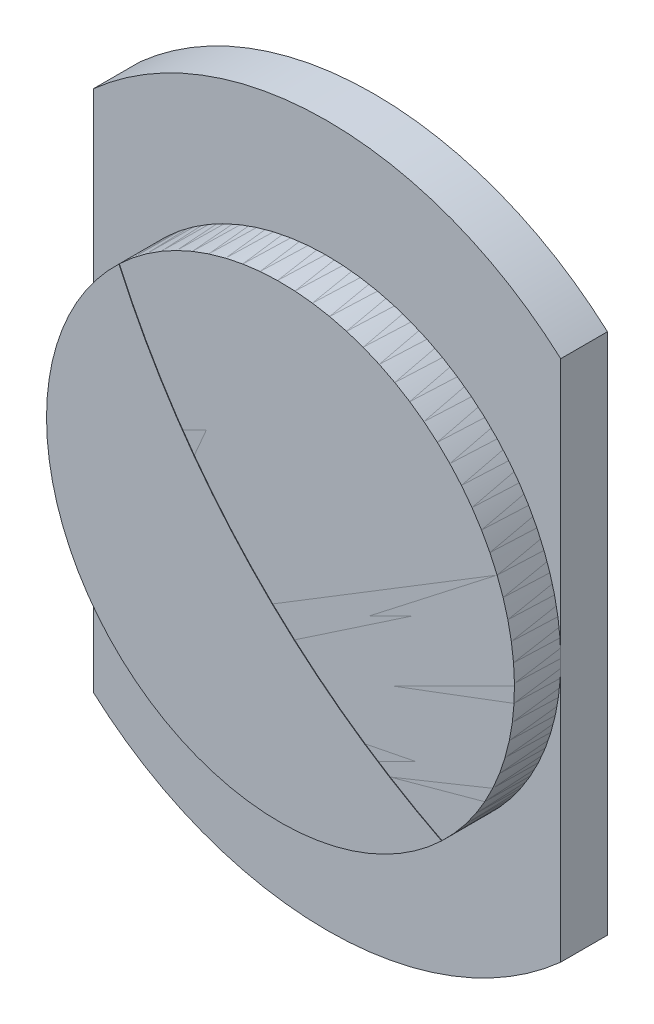
ISO-10303-21;
HEADER;
FILE_DESCRIPTION(('STEP AP214'),'2;1');
FILE_NAME('part.step','',(''),(''),'','','');
FILE_SCHEMA(('AUTOMOTIVE_DESIGN { 1 0 10303 214 1 1 1 1 }'));
ENDSEC;
DATA;
#1=APPLICATION_CONTEXT('core data for automotive mechanical design processes');
#2=APPLICATION_PROTOCOL_DEFINITION('international standard','automotive_design',2000,#1);
#3=PRODUCT_CONTEXT('',#1,'mechanical');
#4=PRODUCT('Part','Part','',(#3));
#5=PRODUCT_RELATED_PRODUCT_CATEGORY('part','',(#4));
#6=PRODUCT_DEFINITION_FORMATION('','',#4);
#7=PRODUCT_DEFINITION_CONTEXT('part definition',#1,'design');
#8=PRODUCT_DEFINITION('design','',#6,#7);
#9=PRODUCT_DEFINITION_SHAPE('','',#8);
#10=(LENGTH_UNIT() NAMED_UNIT(*) SI_UNIT(.MILLI.,.METRE.));
#11=(NAMED_UNIT(*) PLANE_ANGLE_UNIT() SI_UNIT($,.RADIAN.));
#12=(NAMED_UNIT(*) SI_UNIT($,.STERADIAN.) SOLID_ANGLE_UNIT());
#13=UNCERTAINTY_MEASURE_WITH_UNIT(LENGTH_MEASURE(1.E-05),#10,'distance_accuracy_value','');
#14=(GEOMETRIC_REPRESENTATION_CONTEXT(3) GLOBAL_UNCERTAINTY_ASSIGNED_CONTEXT((#13)) GLOBAL_UNIT_ASSIGNED_CONTEXT((#10,
#11,#12)) REPRESENTATION_CONTEXT('',''));
#15=CARTESIAN_POINT('',(0.,0.,0.));
#16=DIRECTION('',(0.,0.,1.));
#17=DIRECTION('',(1.,0.,0.));
#18=AXIS2_PLACEMENT_3D('',#15,#16,#17);
#19=CARTESIAN_POINT('',(10.2337230542793,9.76068196635418,-12.070248418297));
#20=DIRECTION('',(0.,0.,1.));
#21=DIRECTION('',(1.,0.,0.));
#22=AXIS2_PLACEMENT_3D('',#19,#20,#21);
#23=CYLINDRICAL_SURFACE('',#22,15.);
#24=CARTESIAN_POINT('',(10.2337230542793,9.76068196635418,0.));
#25=DIRECTION('',(0.,0.,1.));
#26=DIRECTION('',(1.,0.,0.));
#27=AXIS2_PLACEMENT_3D('',#24,#25,#26);
#28=CIRCLE('',#27,15.);
#29=CARTESIAN_POINT('',(3.45092220370713,-3.61816748423302,0.));
#30=VERTEX_POINT('',#29);
#31=CARTESIAN_POINT('',(-3.45092220370715,3.618167484233,0.));
#32=VERTEX_POINT('',#31);
#33=EDGE_CURVE('E66',#30,#32,#28,.F.);
#34=ORIENTED_EDGE('',*,*,#33,.F.);
#35=DIRECTION('',(0.,0.,1.));
#36=VECTOR('',#35,1.);
#37=CARTESIAN_POINT('',(3.45092220370713,-3.61816748423302,-12.070248418297));
#38=LINE('',#37,#36);
#39=CARTESIAN_POINT('',(3.45092220370713,-3.61816748423302,1.99));
#40=VERTEX_POINT('',#39);
#41=EDGE_CURVE('E86',#30,#40,#38,.T.);
#42=ORIENTED_EDGE('',*,*,#41,.T.);
#43=CARTESIAN_POINT('',(10.2337230542793,9.76068196635418,1.99));
#44=DIRECTION('',(0.,0.,1.));
#45=DIRECTION('',(1.,0.,0.));
#46=AXIS2_PLACEMENT_3D('',#43,#44,#45);
#47=CIRCLE('',#46,15.);
#48=CARTESIAN_POINT('',(-3.45092220370715,3.618167484233,1.99));
#49=VERTEX_POINT('',#48);
#50=EDGE_CURVE('E88',#49,#40,#47,.T.);
#51=ORIENTED_EDGE('',*,*,#50,.F.);
#52=DIRECTION('',(0.,0.,1.));
#53=VECTOR('',#52,1.);
#54=CARTESIAN_POINT('',(-3.45092220370715,3.618167484233,-12.070248418297));
#55=LINE('',#54,#53);
#56=EDGE_CURVE('E92',#32,#49,#55,.T.);
#57=ORIENTED_EDGE('',*,*,#56,.F.);
#58=EDGE_LOOP('',(#34,#42,#51,#57));
#59=FACE_BOUND('',#58,.T.);
#60=ADVANCED_FACE('F56',(#59),#23,.T.);
#61=CARTESIAN_POINT('',(0.,0.,-12.070248418297));
#62=DIRECTION('',(0.,0.,1.));
#63=DIRECTION('',(1.,0.,0.));
#64=AXIS2_PLACEMENT_3D('',#61,#62,#63);
#65=CYLINDRICAL_SURFACE('',#64,5.);
#66=CARTESIAN_POINT('',(0.,0.,0.));
#67=DIRECTION('',(0.,0.,1.));
#68=DIRECTION('',(1.,0.,0.));
#69=AXIS2_PLACEMENT_3D('',#66,#67,#68);
#70=CIRCLE('',#69,5.);
#71=EDGE_CURVE('E12',#32,#30,#70,.F.);
#72=ORIENTED_EDGE('',*,*,#71,.F.);
#73=ORIENTED_EDGE('',*,*,#56,.T.);
#74=CARTESIAN_POINT('',(0.,0.,1.99));
#75=DIRECTION('',(0.,0.,1.));
#76=DIRECTION('',(1.,0.,0.));
#77=AXIS2_PLACEMENT_3D('',#74,#75,#76);
#78=CIRCLE('',#77,5.);
#79=EDGE_CURVE('E94',#40,#49,#78,.T.);
#80=ORIENTED_EDGE('',*,*,#79,.F.);
#81=ORIENTED_EDGE('',*,*,#41,.F.);
#82=EDGE_LOOP('',(#72,#73,#80,#81));
#83=FACE_BOUND('',#82,.T.);
#84=ADVANCED_FACE('F99',(#83),#65,.T.);
#85=CARTESIAN_POINT('',(5.11686152713966,4.88034098317709,1.99));
#86=DIRECTION('',(0.,0.,1.));
#87=DIRECTION('',(1.,0.,0.));
#88=AXIS2_PLACEMENT_3D('',#85,#86,#87);
#89=PLANE('',#88);
#90=ORIENTED_EDGE('',*,*,#50,.T.);
#91=ORIENTED_EDGE('',*,*,#79,.T.);
#92=EDGE_LOOP('',(#90,#91));
#93=FACE_BOUND('',#92,.T.);
#94=ADVANCED_FACE('F97',(#93),#89,.T.);
#95=CARTESIAN_POINT('',(0.,0.,0.));
#96=DIRECTION('',(0.,0.,1.));
#97=DIRECTION('',(1.,0.,0.));
#98=AXIS2_PLACEMENT_3D('',#95,#96,#97);
#99=PLANE('',#98);
#100=ORIENTED_EDGE('',*,*,#33,.T.);
#101=ORIENTED_EDGE('',*,*,#71,.T.);
#102=EDGE_LOOP('',(#100,#101));
#103=FACE_BOUND('',#102,.T.);
#104=ADVANCED_FACE('F113',(#103),#99,.F.);
#105=CLOSED_SHELL('',(#60,#84,#94,#104));
#106=MANIFOLD_SOLID_BREP('B2',#105);
#107=CARTESIAN_POINT('',(0.,0.,1.));
#108=DIRECTION('',(0.,0.,1.));
#109=DIRECTION('',(1.,0.,0.));
#110=AXIS2_PLACEMENT_3D('',#107,#108,#109);
#111=PLANE('',#110);
#112=CARTESIAN_POINT('',(0.,0.,1.));
#113=DIRECTION('',(0.,0.,1.));
#114=DIRECTION('',(1.,0.,0.));
#115=AXIS2_PLACEMENT_3D('',#112,#113,#114);
#116=CIRCLE('',#115,7.5);
#117=CARTESIAN_POINT('',(5.,5.59016994374947,1.));
#118=VERTEX_POINT('',#117);
#119=CARTESIAN_POINT('',(-5.,5.59016994374947,1.));
#120=VERTEX_POINT('',#119);
#121=EDGE_CURVE('E275',#118,#120,#116,.T.);
#122=ORIENTED_EDGE('',*,*,#121,.T.);
#123=DIRECTION('',(0.,-1.,0.));
#124=VECTOR('',#123,1.);
#125=CARTESIAN_POINT('',(-5.,0.,1.));
#126=LINE('',#125,#124);
#127=CARTESIAN_POINT('',(-5.,0.,1.));
#128=VERTEX_POINT('',#127);
#129=EDGE_CURVE('E244',#120,#128,#126,.T.);
#130=ORIENTED_EDGE('',*,*,#129,.T.);
#131=CARTESIAN_POINT('',(0.,0.,1.));
#132=DIRECTION('',(0.,0.,1.));
#133=DIRECTION('',(1.,0.,0.));
#134=AXIS2_PLACEMENT_3D('',#131,#132,#133);
#135=CIRCLE('',#134,5.);
#136=CARTESIAN_POINT('',(5.,0.,1.));
#137=VERTEX_POINT('',#136);
#138=EDGE_CURVE('E151',#137,#128,#135,.T.);
#139=ORIENTED_EDGE('',*,*,#138,.F.);
#140=DIRECTION('',(0.,-1.,0.));
#141=VECTOR('',#140,1.);
#142=CARTESIAN_POINT('',(5.,0.,1.));
#143=LINE('',#142,#141);
#144=EDGE_CURVE('E257',#118,#137,#143,.T.);
#145=ORIENTED_EDGE('',*,*,#144,.F.);
#146=EDGE_LOOP('',(#122,#130,#139,#145));
#147=FACE_BOUND('',#146,.T.);
#148=ADVANCED_FACE('F141',(#147),#111,.T.);
#149=EDGE_CURVE('E272',#128,#137,#135,.T.);
#150=ORIENTED_EDGE('',*,*,#149,.F.);
#151=CARTESIAN_POINT('',(-5.,-5.59016994374947,1.));
#152=VERTEX_POINT('',#151);
#153=EDGE_CURVE('E243',#128,#152,#126,.T.);
#154=ORIENTED_EDGE('',*,*,#153,.T.);
#155=CARTESIAN_POINT('',(5.,-5.59016994374947,1.));
#156=VERTEX_POINT('',#155);
#157=EDGE_CURVE('E273',#152,#156,#116,.T.);
#158=ORIENTED_EDGE('',*,*,#157,.T.);
#159=EDGE_CURVE('E236',#137,#156,#143,.T.);
#160=ORIENTED_EDGE('',*,*,#159,.F.);
#161=EDGE_LOOP('',(#150,#154,#158,#160));
#162=FACE_BOUND('',#161,.T.);
#163=ADVANCED_FACE('F303',(#162),#111,.T.);
#164=CARTESIAN_POINT('',(0.,0.,0.));
#165=DIRECTION('',(0.,0.,1.));
#166=DIRECTION('',(1.,0.,0.));
#167=AXIS2_PLACEMENT_3D('',#164,#165,#166);
#168=PLANE('',#167);
#169=CARTESIAN_POINT('',(0.,0.,0.));
#170=DIRECTION('',(0.,0.,1.));
#171=DIRECTION('',(1.,0.,0.));
#172=AXIS2_PLACEMENT_3D('',#169,#170,#171);
#173=CIRCLE('',#172,7.5);
#174=CARTESIAN_POINT('',(-5.,-5.59016994374947,0.));
#175=VERTEX_POINT('',#174);
#176=CARTESIAN_POINT('',(5.,-5.59016994374947,0.));
#177=VERTEX_POINT('',#176);
#178=EDGE_CURVE('E270',#175,#177,#173,.T.);
#179=ORIENTED_EDGE('',*,*,#178,.F.);
#180=DIRECTION('',(0.,1.,0.));
#181=VECTOR('',#180,1.);
#182=CARTESIAN_POINT('',(-5.,0.,0.));
#183=LINE('',#182,#181);
#184=CARTESIAN_POINT('',(-5.,5.59016994374947,0.));
#185=VERTEX_POINT('',#184);
#186=EDGE_CURVE('E239',#175,#185,#183,.T.);
#187=ORIENTED_EDGE('',*,*,#186,.T.);
#188=CARTESIAN_POINT('',(5.,5.59016994374947,0.));
#189=VERTEX_POINT('',#188);
#190=EDGE_CURVE('E277',#189,#185,#173,.T.);
#191=ORIENTED_EDGE('',*,*,#190,.F.);
#192=DIRECTION('',(0.,1.,0.));
#193=VECTOR('',#192,1.);
#194=CARTESIAN_POINT('',(5.,0.,0.));
#195=LINE('',#194,#193);
#196=EDGE_CURVE('E242',#177,#189,#195,.T.);
#197=ORIENTED_EDGE('',*,*,#196,.F.);
#198=EDGE_LOOP('',(#179,#187,#191,#197));
#199=FACE_BOUND('',#198,.T.);
#200=ADVANCED_FACE('F292',(#199),#168,.F.);
#201=CARTESIAN_POINT('',(0.,0.,1.));
#202=DIRECTION('',(0.,0.,-1.));
#203=DIRECTION('',(-1.,0.,0.));
#204=AXIS2_PLACEMENT_3D('',#201,#202,#203);
#205=CYLINDRICAL_SURFACE('',#204,7.5);
#206=DIRECTION('',(0.,0.,1.));
#207=VECTOR('',#206,1.);
#208=CARTESIAN_POINT('',(-5.,-5.59016994374947,-0.000999999999999916));
#209=LINE('',#208,#207);
#210=EDGE_CURVE('E249',#175,#152,#209,.T.);
#211=ORIENTED_EDGE('',*,*,#210,.F.);
#212=ORIENTED_EDGE('',*,*,#178,.T.);
#213=DIRECTION('',(0.,0.,1.));
#214=VECTOR('',#213,1.);
#215=CARTESIAN_POINT('',(5.,-5.59016994374947,-0.000999999999999916));
#216=LINE('',#215,#214);
#217=EDGE_CURVE('E167',#177,#156,#216,.T.);
#218=ORIENTED_EDGE('',*,*,#217,.T.);
#219=ORIENTED_EDGE('',*,*,#157,.F.);
#220=EDGE_LOOP('',(#211,#212,#218,#219));
#221=FACE_BOUND('',#220,.T.);
#222=ADVANCED_FACE('F143',(#221),#205,.T.);
#223=ORIENTED_EDGE('',*,*,#190,.T.);
#224=DIRECTION('',(0.,0.,1.));
#225=VECTOR('',#224,1.);
#226=CARTESIAN_POINT('',(-5.,5.59016994374947,-0.000999999999999916));
#227=LINE('',#226,#225);
#228=EDGE_CURVE('E248',#185,#120,#227,.T.);
#229=ORIENTED_EDGE('',*,*,#228,.T.);
#230=ORIENTED_EDGE('',*,*,#121,.F.);
#231=DIRECTION('',(0.,0.,1.));
#232=VECTOR('',#231,1.);
#233=CARTESIAN_POINT('',(5.,5.59016994374947,-0.000999999999999916));
#234=LINE('',#233,#232);
#235=EDGE_CURVE('E256',#189,#118,#234,.T.);
#236=ORIENTED_EDGE('',*,*,#235,.F.);
#237=EDGE_LOOP('',(#223,#229,#230,#236));
#238=FACE_BOUND('',#237,.T.);
#239=ADVANCED_FACE('F298',(#238),#205,.T.);
#240=CARTESIAN_POINT('',(0.,0.,2.));
#241=DIRECTION('',(0.,0.,-1.));
#242=DIRECTION('',(-1.,0.,0.));
#243=AXIS2_PLACEMENT_3D('',#240,#241,#242);
#244=CYLINDRICAL_SURFACE('',#243,5.);
#245=CARTESIAN_POINT('',(0.,0.,1.99));
#246=DIRECTION('',(0.,0.,1.));
#247=DIRECTION('',(1.,0.,0.));
#248=AXIS2_PLACEMENT_3D('',#245,#246,#247);
#249=CIRCLE('',#248,5.);
#250=CARTESIAN_POINT('',(3.45092220370714,-3.61816748423301,1.99));
#251=VERTEX_POINT('',#250);
#252=CARTESIAN_POINT('',(-3.45092220370715,3.61816748423301,1.99));
#253=VERTEX_POINT('',#252);
#254=EDGE_CURVE('E60',#251,#253,#249,.T.);
#255=ORIENTED_EDGE('',*,*,#254,.F.);
#256=DIRECTION('',(0.,0.,1.));
#257=VECTOR('',#256,1.);
#258=CARTESIAN_POINT('',(3.45092220370714,-3.61816748423301,1.995));
#259=LINE('',#258,#257);
#260=CARTESIAN_POINT('',(3.45092220370714,-3.61816748423301,2.));
#261=VERTEX_POINT('',#260);
#262=EDGE_CURVE('E225',#251,#261,#259,.T.);
#263=ORIENTED_EDGE('',*,*,#262,.T.);
#264=CARTESIAN_POINT('',(0.,0.,2.));
#265=DIRECTION('',(0.,0.,1.));
#266=DIRECTION('',(1.,0.,0.));
#267=AXIS2_PLACEMENT_3D('',#264,#265,#266);
#268=CIRCLE('',#267,5.);
#269=CARTESIAN_POINT('',(-3.45092220370715,3.61816748423301,2.));
#270=VERTEX_POINT('',#269);
#271=EDGE_CURVE('E229',#270,#261,#268,.T.);
#272=ORIENTED_EDGE('',*,*,#271,.F.);
#273=DIRECTION('',(0.,0.,1.));
#274=VECTOR('',#273,1.);
#275=CARTESIAN_POINT('',(-3.45092220370715,3.61816748423301,1.995));
#276=LINE('',#275,#274);
#277=EDGE_CURVE('E217',#270,#253,#276,.F.);
#278=ORIENTED_EDGE('',*,*,#277,.T.);
#279=EDGE_LOOP('',(#255,#263,#272,#278));
#280=FACE_BOUND('',#279,.T.);
#281=ORIENTED_EDGE('',*,*,#138,.T.);
#282=ORIENTED_EDGE('',*,*,#149,.T.);
#283=EDGE_LOOP('',(#281,#282));
#284=FACE_BOUND('',#283,.T.);
#285=ADVANCED_FACE('F227',(#280,#284),#244,.T.);
#286=CARTESIAN_POINT('',(0.,0.,2.));
#287=DIRECTION('',(0.,0.,1.));
#288=DIRECTION('',(1.,0.,0.));
#289=AXIS2_PLACEMENT_3D('',#286,#287,#288);
#290=PLANE('',#289);
#291=CARTESIAN_POINT('',(10.2337230542793,9.76068196635418,2.));
#292=DIRECTION('',(0.,0.,1.));
#293=DIRECTION('',(1.,0.,0.));
#294=AXIS2_PLACEMENT_3D('',#291,#292,#293);
#295=CIRCLE('',#294,15.);
#296=EDGE_CURVE('E222',#270,#261,#295,.T.);
#297=ORIENTED_EDGE('',*,*,#296,.F.);
#298=ORIENTED_EDGE('',*,*,#271,.T.);
#299=EDGE_LOOP('',(#297,#298));
#300=FACE_BOUND('',#299,.T.);
#301=ADVANCED_FACE('F307',(#300),#290,.T.);
#302=CARTESIAN_POINT('',(5.,0.,-0.000999999999999916));
#303=DIRECTION('',(-1.,0.,0.));
#304=DIRECTION('',(0.,0.,1.));
#305=AXIS2_PLACEMENT_3D('',#302,#303,#304);
#306=PLANE('',#305);
#307=ORIENTED_EDGE('',*,*,#196,.T.);
#308=ORIENTED_EDGE('',*,*,#235,.T.);
#309=ORIENTED_EDGE('',*,*,#144,.T.);
#310=ORIENTED_EDGE('',*,*,#159,.T.);
#311=ORIENTED_EDGE('',*,*,#217,.F.);
#312=EDGE_LOOP('',(#307,#308,#309,#310,#311));
#313=FACE_BOUND('',#312,.T.);
#314=ADVANCED_FACE('F291',(#313),#306,.F.);
#315=CARTESIAN_POINT('',(-5.,0.,-0.000999999999999916));
#316=DIRECTION('',(-1.,0.,0.));
#317=DIRECTION('',(0.,0.,1.));
#318=AXIS2_PLACEMENT_3D('',#315,#316,#317);
#319=PLANE('',#318);
#320=ORIENTED_EDGE('',*,*,#210,.T.);
#321=ORIENTED_EDGE('',*,*,#153,.F.);
#322=ORIENTED_EDGE('',*,*,#129,.F.);
#323=ORIENTED_EDGE('',*,*,#228,.F.);
#324=ORIENTED_EDGE('',*,*,#186,.F.);
#325=EDGE_LOOP('',(#320,#321,#322,#323,#324));
#326=FACE_BOUND('',#325,.T.);
#327=ADVANCED_FACE('F320',(#326),#319,.T.);
#328=CARTESIAN_POINT('',(10.2337230542793,9.76068196635418,1.99));
#329=DIRECTION('',(0.,0.,1.));
#330=DIRECTION('',(1.,0.,0.));
#331=AXIS2_PLACEMENT_3D('',#328,#329,#330);
#332=PLANE('',#331);
#333=ORIENTED_EDGE('',*,*,#254,.T.);
#334=CARTESIAN_POINT('',(10.2337230542793,9.76068196635418,1.99));
#335=DIRECTION('',(0.,0.,1.));
#336=DIRECTION('',(1.,0.,0.));
#337=AXIS2_PLACEMENT_3D('',#334,#335,#336);
#338=CIRCLE('',#337,15.);
#339=EDGE_CURVE('E159',#253,#251,#338,.T.);
#340=ORIENTED_EDGE('',*,*,#339,.T.);
#341=EDGE_LOOP('',(#333,#340));
#342=FACE_BOUND('',#341,.T.);
#343=ADVANCED_FACE('F211',(#342),#332,.T.);
#344=CARTESIAN_POINT('',(10.2337230542793,9.76068196635418,1.99));
#345=DIRECTION('',(0.,0.,1.));
#346=DIRECTION('',(1.,0.,0.));
#347=AXIS2_PLACEMENT_3D('',#344,#345,#346);
#348=CYLINDRICAL_SURFACE('',#347,15.);
#349=ORIENTED_EDGE('',*,*,#339,.F.);
#350=ORIENTED_EDGE('',*,*,#277,.F.);
#351=ORIENTED_EDGE('',*,*,#296,.T.);
#352=ORIENTED_EDGE('',*,*,#262,.F.);
#353=EDGE_LOOP('',(#349,#350,#351,#352));
#354=FACE_BOUND('',#353,.T.);
#355=ADVANCED_FACE('F218',(#354),#348,.F.);
#356=CLOSED_SHELL('',(#148,#163,#200,#222,#239,#285,#301,#314,#327,#343,#355));
#357=MANIFOLD_SOLID_BREP('B6',#356);
#358=ADVANCED_BREP_SHAPE_REPRESENTATION('',(#18,#106,#357),#14);
#359=SHAPE_DEFINITION_REPRESENTATION(#9,#358);
ENDSEC;
END-ISO-10303-21;
